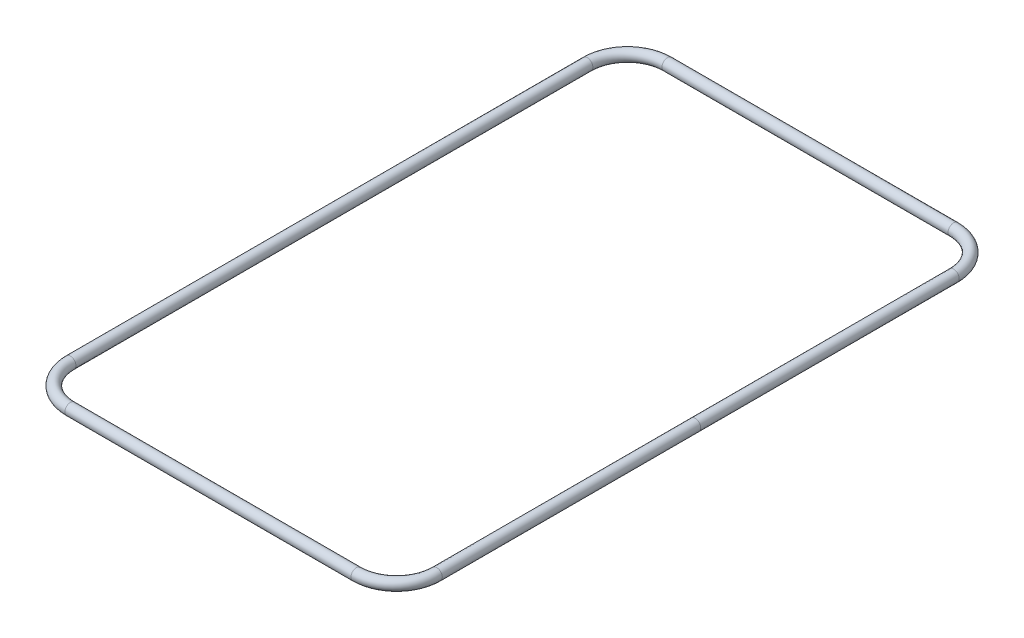
ISO-10303-21;
HEADER;
FILE_DESCRIPTION(('STEP AP214'),'2;1');
FILE_NAME('part.step','',(''),(''),'','','');
FILE_SCHEMA(('AUTOMOTIVE_DESIGN { 1 0 10303 214 1 1 1 1 }'));
ENDSEC;
DATA;
#1=APPLICATION_CONTEXT('core data for automotive mechanical design processes');
#2=APPLICATION_PROTOCOL_DEFINITION('international standard','automotive_design',2000,#1);
#3=PRODUCT_CONTEXT('',#1,'mechanical');
#4=PRODUCT('Part','Part','',(#3));
#5=PRODUCT_RELATED_PRODUCT_CATEGORY('part','',(#4));
#6=PRODUCT_DEFINITION_FORMATION('','',#4);
#7=PRODUCT_DEFINITION_CONTEXT('part definition',#1,'design');
#8=PRODUCT_DEFINITION('design','',#6,#7);
#9=PRODUCT_DEFINITION_SHAPE('','',#8);
#10=(LENGTH_UNIT() NAMED_UNIT(*) SI_UNIT(.MILLI.,.METRE.));
#11=(NAMED_UNIT(*) PLANE_ANGLE_UNIT() SI_UNIT($,.RADIAN.));
#12=(NAMED_UNIT(*) SI_UNIT($,.STERADIAN.) SOLID_ANGLE_UNIT());
#13=UNCERTAINTY_MEASURE_WITH_UNIT(LENGTH_MEASURE(1.E-05),#10,'distance_accuracy_value','');
#14=(GEOMETRIC_REPRESENTATION_CONTEXT(3) GLOBAL_UNCERTAINTY_ASSIGNED_CONTEXT((#13)) GLOBAL_UNIT_ASSIGNED_CONTEXT((#10,
#11,#12)) REPRESENTATION_CONTEXT('',''));
#15=CARTESIAN_POINT('',(0.,0.,0.));
#16=DIRECTION('',(0.,0.,1.));
#17=DIRECTION('',(1.,0.,0.));
#18=AXIS2_PLACEMENT_3D('',#15,#16,#17);
#19=CARTESIAN_POINT('',(57.9965016497048,0.,-81.8388));
#20=DIRECTION('',(0.,0.,1.));
#21=DIRECTION('',(1.,0.,0.));
#22=AXIS2_PLACEMENT_3D('',#19,#20,#21);
#23=CYLINDRICAL_SURFACE('',#22,1.76529999999999);
#24=CARTESIAN_POINT('',(57.9965016497048,0.,0.));
#25=DIRECTION('',(0.,0.,1.));
#26=DIRECTION('',(1.,0.,0.));
#27=AXIS2_PLACEMENT_3D('',#24,#25,#26);
#28=CIRCLE('',#27,1.76529999999999);
#29=CARTESIAN_POINT('',(59.7618016497048,0.,0.));
#30=VERTEX_POINT('',#29);
#31=EDGE_CURVE('E61',#30,#30,#28,.T.);
#32=ORIENTED_EDGE('',*,*,#31,.F.);
#33=EDGE_LOOP('',(#32));
#34=FACE_BOUND('',#33,.T.);
#35=CARTESIAN_POINT('',(57.9965016497048,0.,-81.8388000000003));
#36=DIRECTION('',(0.,0.,1.));
#37=DIRECTION('',(1.,0.,0.));
#38=AXIS2_PLACEMENT_3D('',#35,#36,#37);
#39=CIRCLE('',#38,1.76529999999999);
#40=CARTESIAN_POINT('',(59.7618016497048,0.,-81.8388000000003));
#41=VERTEX_POINT('',#40);
#42=EDGE_CURVE('E10',#41,#41,#39,.T.);
#43=ORIENTED_EDGE('',*,*,#42,.T.);
#44=EDGE_LOOP('',(#43));
#45=FACE_BOUND('',#44,.T.);
#46=ADVANCED_FACE('F30',(#34,#45),#23,.T.);
#47=CARTESIAN_POINT('',(45.2965016497048,0.,-81.8388));
#48=DIRECTION('',(0.,-1.,0.));
#49=DIRECTION('',(0.,0.,-1.));
#50=AXIS2_PLACEMENT_3D('',#47,#48,#49);
#51=TOROIDAL_SURFACE('',#50,12.7,1.76529999999999);
#52=CARTESIAN_POINT('',(45.2965016497047,0.,-94.5388));
#53=DIRECTION('',(1.,0.,0.));
#54=DIRECTION('',(0.,0.,-1.));
#55=AXIS2_PLACEMENT_3D('',#52,#53,#54);
#56=CIRCLE('',#55,1.76529999999999);
#57=CARTESIAN_POINT('',(45.2965016497047,0.,-96.3041));
#58=VERTEX_POINT('',#57);
#59=EDGE_CURVE('E36',#58,#58,#56,.T.);
#60=CARTESIAN_POINT('',(45.2965016497048,0.,-81.8388));
#61=DIRECTION('',(0.,-1.,0.));
#62=DIRECTION('',(0.,0.,-1.));
#63=AXIS2_PLACEMENT_3D('',#60,#61,#62);
#64=CIRCLE('',#63,14.4653);
#65=EDGE_CURVE('',#58,#41,#64,.T.);
#66=ORIENTED_EDGE('',*,*,#59,.T.);
#67=ORIENTED_EDGE('',*,*,#42,.F.);
#68=ORIENTED_EDGE('',*,*,#65,.T.);
#69=ORIENTED_EDGE('',*,*,#65,.F.);
#70=EDGE_LOOP('',(#66,#68,#67,#69));
#71=FACE_BOUND('',#70,.T.);
#72=ADVANCED_FACE('F68',(#71),#51,.T.);
#73=CARTESIAN_POINT('',(-45.2965016497049,0.,-94.5388));
#74=DIRECTION('',(1.,0.,0.));
#75=DIRECTION('',(0.,0.,-1.));
#76=AXIS2_PLACEMENT_3D('',#73,#74,#75);
#77=CYLINDRICAL_SURFACE('',#76,1.76529999999999);
#78=ORIENTED_EDGE('',*,*,#59,.F.);
#79=EDGE_LOOP('',(#78));
#80=FACE_BOUND('',#79,.T.);
#81=CARTESIAN_POINT('',(-45.2965016497049,0.,-94.5388));
#82=DIRECTION('',(1.,0.,0.));
#83=DIRECTION('',(0.,0.,-1.));
#84=AXIS2_PLACEMENT_3D('',#81,#82,#83);
#85=CIRCLE('',#84,1.76529999999999);
#86=CARTESIAN_POINT('',(-45.2965016497049,0.,-96.3041));
#87=VERTEX_POINT('',#86);
#88=EDGE_CURVE('E40',#87,#87,#85,.T.);
#89=ORIENTED_EDGE('',*,*,#88,.T.);
#90=EDGE_LOOP('',(#89));
#91=FACE_BOUND('',#90,.T.);
#92=ADVANCED_FACE('F72',(#80,#91),#77,.T.);
#93=CARTESIAN_POINT('',(-45.2965016497048,0.,-81.8388));
#94=DIRECTION('',(0.,-1.,0.));
#95=DIRECTION('',(0.,0.,-1.));
#96=AXIS2_PLACEMENT_3D('',#93,#94,#95);
#97=TOROIDAL_SURFACE('',#96,12.7,1.76529999999999);
#98=CARTESIAN_POINT('',(-57.9965016497048,0.,-81.8387999999998));
#99=DIRECTION('',(0.,0.,-1.));
#100=DIRECTION('',(-1.,0.,0.));
#101=AXIS2_PLACEMENT_3D('',#98,#99,#100);
#102=CIRCLE('',#101,1.76529999999999);
#103=CARTESIAN_POINT('',(-59.7618016497048,0.,-81.8387999999998));
#104=VERTEX_POINT('',#103);
#105=EDGE_CURVE('E44',#104,#104,#102,.T.);
#106=CARTESIAN_POINT('',(-45.2965016497048,0.,-81.8388));
#107=DIRECTION('',(0.,-1.,0.));
#108=DIRECTION('',(0.,0.,-1.));
#109=AXIS2_PLACEMENT_3D('',#106,#107,#108);
#110=CIRCLE('',#109,14.4653);
#111=EDGE_CURVE('',#104,#87,#110,.T.);
#112=ORIENTED_EDGE('',*,*,#105,.T.);
#113=ORIENTED_EDGE('',*,*,#88,.F.);
#114=ORIENTED_EDGE('',*,*,#111,.T.);
#115=ORIENTED_EDGE('',*,*,#111,.F.);
#116=EDGE_LOOP('',(#112,#114,#113,#115));
#117=FACE_BOUND('',#116,.T.);
#118=ADVANCED_FACE('F77',(#117),#97,.T.);
#119=CARTESIAN_POINT('',(-57.9965016497048,0.,81.8388000000001));
#120=DIRECTION('',(0.,0.,-1.));
#121=DIRECTION('',(-1.,0.,0.));
#122=AXIS2_PLACEMENT_3D('',#119,#120,#121);
#123=CYLINDRICAL_SURFACE('',#122,1.76529999999999);
#124=ORIENTED_EDGE('',*,*,#105,.F.);
#125=EDGE_LOOP('',(#124));
#126=FACE_BOUND('',#125,.T.);
#127=CARTESIAN_POINT('',(-57.9965016497048,0.,81.8388000000001));
#128=DIRECTION('',(0.,0.,-1.));
#129=DIRECTION('',(-1.,0.,0.));
#130=AXIS2_PLACEMENT_3D('',#127,#128,#129);
#131=CIRCLE('',#130,1.76529999999999);
#132=CARTESIAN_POINT('',(-59.7618016497048,0.,81.8388000000001));
#133=VERTEX_POINT('',#132);
#134=EDGE_CURVE('E49',#133,#133,#131,.T.);
#135=ORIENTED_EDGE('',*,*,#134,.T.);
#136=EDGE_LOOP('',(#135));
#137=FACE_BOUND('',#136,.T.);
#138=ADVANCED_FACE('F83',(#126,#137),#123,.T.);
#139=CARTESIAN_POINT('',(-45.2965016497048,0.,81.8388));
#140=DIRECTION('',(0.,-1.,0.));
#141=DIRECTION('',(0.,0.,-1.));
#142=AXIS2_PLACEMENT_3D('',#139,#140,#141);
#143=TOROIDAL_SURFACE('',#142,12.7,1.76529999999999);
#144=CARTESIAN_POINT('',(-45.2965016497047,0.,94.5388));
#145=DIRECTION('',(-1.,0.,0.));
#146=DIRECTION('',(0.,0.,1.));
#147=AXIS2_PLACEMENT_3D('',#144,#145,#146);
#148=CIRCLE('',#147,1.76529999999999);
#149=CARTESIAN_POINT('',(-45.2965016497047,0.,96.3041));
#150=VERTEX_POINT('',#149);
#151=EDGE_CURVE('E52',#150,#150,#148,.T.);
#152=CARTESIAN_POINT('',(-45.2965016497048,0.,81.8388));
#153=DIRECTION('',(0.,-1.,0.));
#154=DIRECTION('',(0.,0.,-1.));
#155=AXIS2_PLACEMENT_3D('',#152,#153,#154);
#156=CIRCLE('',#155,14.4653);
#157=EDGE_CURVE('',#150,#133,#156,.T.);
#158=ORIENTED_EDGE('',*,*,#151,.T.);
#159=ORIENTED_EDGE('',*,*,#134,.F.);
#160=ORIENTED_EDGE('',*,*,#157,.T.);
#161=ORIENTED_EDGE('',*,*,#157,.F.);
#162=EDGE_LOOP('',(#158,#160,#159,#161));
#163=FACE_BOUND('',#162,.T.);
#164=ADVANCED_FACE('F87',(#163),#143,.T.);
#165=CARTESIAN_POINT('',(45.2965016497049,0.,94.5388));
#166=DIRECTION('',(-1.,0.,0.));
#167=DIRECTION('',(0.,0.,1.));
#168=AXIS2_PLACEMENT_3D('',#165,#166,#167);
#169=CYLINDRICAL_SURFACE('',#168,1.76529999999999);
#170=ORIENTED_EDGE('',*,*,#151,.F.);
#171=EDGE_LOOP('',(#170));
#172=FACE_BOUND('',#171,.T.);
#173=CARTESIAN_POINT('',(45.2965016497049,0.,94.5388));
#174=DIRECTION('',(-1.,0.,0.));
#175=DIRECTION('',(0.,0.,1.));
#176=AXIS2_PLACEMENT_3D('',#173,#174,#175);
#177=CIRCLE('',#176,1.76529999999999);
#178=CARTESIAN_POINT('',(45.2965016497049,0.,96.3041));
#179=VERTEX_POINT('',#178);
#180=EDGE_CURVE('E55',#179,#179,#177,.T.);
#181=ORIENTED_EDGE('',*,*,#180,.T.);
#182=EDGE_LOOP('',(#181));
#183=FACE_BOUND('',#182,.T.);
#184=ADVANCED_FACE('F91',(#172,#183),#169,.T.);
#185=CARTESIAN_POINT('',(45.2965016497048,0.,81.8388));
#186=DIRECTION('',(0.,-1.,0.));
#187=DIRECTION('',(0.,0.,-1.));
#188=AXIS2_PLACEMENT_3D('',#185,#186,#187);
#189=TOROIDAL_SURFACE('',#188,12.7,1.76529999999999);
#190=CARTESIAN_POINT('',(57.9965016497048,0.,81.8387999999999));
#191=DIRECTION('',(0.,0.,1.));
#192=DIRECTION('',(1.,0.,0.));
#193=AXIS2_PLACEMENT_3D('',#190,#191,#192);
#194=CIRCLE('',#193,1.76529999999999);
#195=CARTESIAN_POINT('',(59.7618016497048,0.,81.8387999999999));
#196=VERTEX_POINT('',#195);
#197=EDGE_CURVE('E58',#196,#196,#194,.T.);
#198=CARTESIAN_POINT('',(45.2965016497048,0.,81.8388));
#199=DIRECTION('',(0.,-1.,0.));
#200=DIRECTION('',(0.,0.,-1.));
#201=AXIS2_PLACEMENT_3D('',#198,#199,#200);
#202=CIRCLE('',#201,14.4653);
#203=EDGE_CURVE('',#196,#179,#202,.T.);
#204=ORIENTED_EDGE('',*,*,#197,.T.);
#205=ORIENTED_EDGE('',*,*,#180,.F.);
#206=ORIENTED_EDGE('',*,*,#203,.T.);
#207=ORIENTED_EDGE('',*,*,#203,.F.);
#208=EDGE_LOOP('',(#204,#206,#205,#207));
#209=FACE_BOUND('',#208,.T.);
#210=ADVANCED_FACE('F95',(#209),#189,.T.);
#211=CARTESIAN_POINT('',(57.9965016497048,0.,0.));
#212=DIRECTION('',(0.,0.,1.));
#213=DIRECTION('',(1.,0.,0.));
#214=AXIS2_PLACEMENT_3D('',#211,#212,#213);
#215=CYLINDRICAL_SURFACE('',#214,1.76529999999999);
#216=ORIENTED_EDGE('',*,*,#197,.F.);
#217=EDGE_LOOP('',(#216));
#218=FACE_BOUND('',#217,.T.);
#219=ORIENTED_EDGE('',*,*,#31,.T.);
#220=EDGE_LOOP('',(#219));
#221=FACE_BOUND('',#220,.T.);
#222=ADVANCED_FACE('F65',(#218,#221),#215,.T.);
#223=CLOSED_SHELL('',(#46,#72,#92,#118,#138,#164,#184,#210,#222));
#224=MANIFOLD_SOLID_BREP('B2',#223);
#225=ADVANCED_BREP_SHAPE_REPRESENTATION('',(#18,#224),#14);
#226=SHAPE_DEFINITION_REPRESENTATION(#9,#225);
ENDSEC;
END-ISO-10303-21;
